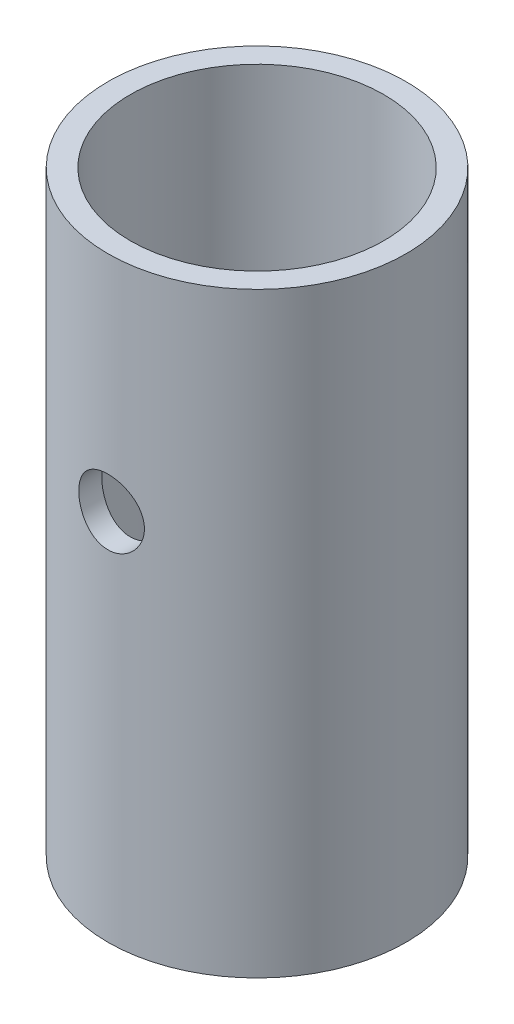
ISO-10303-21;
HEADER;
FILE_DESCRIPTION(('STEP AP214'),'2;1');
FILE_NAME('part.step','',(''),(''),'','','');
FILE_SCHEMA(('AUTOMOTIVE_DESIGN { 1 0 10303 214 1 1 1 1 }'));
ENDSEC;
DATA;
#1=APPLICATION_CONTEXT('core data for automotive mechanical design processes');
#2=APPLICATION_PROTOCOL_DEFINITION('international standard','automotive_design',2000,#1);
#3=PRODUCT_CONTEXT('',#1,'mechanical');
#4=PRODUCT('Part','Part','',(#3));
#5=PRODUCT_RELATED_PRODUCT_CATEGORY('part','',(#4));
#6=PRODUCT_DEFINITION_FORMATION('','',#4);
#7=PRODUCT_DEFINITION_CONTEXT('part definition',#1,'design');
#8=PRODUCT_DEFINITION('design','',#6,#7);
#9=PRODUCT_DEFINITION_SHAPE('','',#8);
#10=(LENGTH_UNIT() NAMED_UNIT(*) SI_UNIT(.MILLI.,.METRE.));
#11=(NAMED_UNIT(*) PLANE_ANGLE_UNIT() SI_UNIT($,.RADIAN.));
#12=(NAMED_UNIT(*) SI_UNIT($,.STERADIAN.) SOLID_ANGLE_UNIT());
#13=UNCERTAINTY_MEASURE_WITH_UNIT(LENGTH_MEASURE(1.E-05),#10,'distance_accuracy_value','');
#14=(GEOMETRIC_REPRESENTATION_CONTEXT(3) GLOBAL_UNCERTAINTY_ASSIGNED_CONTEXT((#13)) GLOBAL_UNIT_ASSIGNED_CONTEXT((#10,
#11,#12)) REPRESENTATION_CONTEXT('',''));
#15=CARTESIAN_POINT('',(0.,0.,0.));
#16=DIRECTION('',(0.,0.,1.));
#17=DIRECTION('',(1.,0.,0.));
#18=AXIS2_PLACEMENT_3D('',#15,#16,#17);
#19=CARTESIAN_POINT('',(0.,20.,0.));
#20=DIRECTION('',(0.,-1.,0.));
#21=DIRECTION('',(0.,0.,-1.));
#22=AXIS2_PLACEMENT_3D('',#19,#20,#21);
#23=CYLINDRICAL_SURFACE('',#22,5.);
#24=CARTESIAN_POINT('',(0.,20.,0.));
#25=DIRECTION('',(0.,1.,0.));
#26=DIRECTION('',(0.,0.,1.));
#27=AXIS2_PLACEMENT_3D('',#24,#25,#26);
#28=CIRCLE('',#27,5.);
#29=CARTESIAN_POINT('',(0.,20.,5.));
#30=VERTEX_POINT('',#29);
#31=EDGE_CURVE('E10',#30,#30,#28,.T.);
#32=ORIENTED_EDGE('',*,*,#31,.F.);
#33=EDGE_LOOP('',(#32));
#34=FACE_BOUND('',#33,.T.);
#35=CARTESIAN_POINT('',(0.,0.,0.));
#36=DIRECTION('',(0.,1.,0.));
#37=DIRECTION('',(0.,0.,1.));
#38=AXIS2_PLACEMENT_3D('',#35,#36,#37);
#39=CIRCLE('',#38,5.);
#40=CARTESIAN_POINT('',(0.,0.,5.));
#41=VERTEX_POINT('',#40);
#42=EDGE_CURVE('E44',#41,#41,#39,.T.);
#43=ORIENTED_EDGE('',*,*,#42,.T.);
#44=EDGE_LOOP('',(#43));
#45=FACE_BOUND('',#44,.T.);
#46=CARTESIAN_POINT('',(-1.1,12.5,4.87749935930288));
#47=CARTESIAN_POINT('',(-1.09999791492612,12.4390201794353,4.87750059192786));
#48=CARTESIAN_POINT('',(-1.09491201866376,12.3780153781133,4.87865539644142));
#49=CARTESIAN_POINT('',(-1.07472546298642,12.2577412903202,4.88314122250592));
#50=CARTESIAN_POINT('',(-1.05961761771207,12.1984732810123,4.88647380552498));
#51=CARTESIAN_POINT('',(-1.0198864288525,12.0834299805971,4.8949199053444));
#52=CARTESIAN_POINT('',(-0.995273595944624,12.0276509102885,4.90003145433793));
#53=CARTESIAN_POINT('',(-0.937261257278608,11.9210123020745,4.91145717082736));
#54=CARTESIAN_POINT('',(-0.903861910884835,11.870152674966,4.91777131651074));
#55=CARTESIAN_POINT('',(-0.828616225712396,11.7739268394913,4.93101133539934));
#56=CARTESIAN_POINT('',(-0.786648093254168,11.7286569406612,4.93794511097894));
#57=CARTESIAN_POINT('',(-0.695719054453303,11.6457392824436,4.95157396934833));
#58=CARTESIAN_POINT('',(-0.646757601115515,11.6080921198395,4.95826903341562));
#59=CARTESIAN_POINT('',(-0.542585501574226,11.5411071356613,4.97075222751559));
#60=CARTESIAN_POINT('',(-0.487313887417923,11.5118620215218,4.97652994590525));
#61=CARTESIAN_POINT('',(-0.372492215823986,11.4631111971503,4.98643815937044));
#62=CARTESIAN_POINT('',(-0.312942645065845,11.4436043810467,4.99056884147106));
#63=CARTESIAN_POINT('',(-0.19225695217033,11.4151870003743,4.99666172270461));
#64=CARTESIAN_POINT('',(-0.131160926699203,11.4061134155394,4.99865724849314));
#65=CARTESIAN_POINT('',(-0.00828344107533832,11.3983102891562,5.00037046767796));
#66=CARTESIAN_POINT('',(0.0534979389590021,11.3995795509866,5.0000884245789));
#67=CARTESIAN_POINT('',(0.174868311810049,11.4123048335302,4.99730372921666));
#68=CARTESIAN_POINT('',(0.234476737170561,11.4235851295636,4.99483938472223));
#69=CARTESIAN_POINT('',(0.350933235851258,11.4557321587748,4.98801066744812));
#70=CARTESIAN_POINT('',(0.40778118327906,11.4765993287116,4.98364620810345));
#71=CARTESIAN_POINT('',(0.517589876653114,11.5274826854318,4.9734461693194));
#72=CARTESIAN_POINT('',(0.570518802020045,11.5575653243528,4.96759995975693));
#73=CARTESIAN_POINT('',(0.670641236268086,11.625976099281,4.95507718712354));
#74=CARTESIAN_POINT('',(0.717833953910853,11.6643053707932,4.94840050975635));
#75=CARTESIAN_POINT('',(0.806189587464993,11.7490775203197,4.9347848703112));
#76=CARTESIAN_POINT('',(0.847204687115553,11.7956741878922,4.92784334554032));
#77=CARTESIAN_POINT('',(0.920866253616029,11.895156171251,4.91461189441242));
#78=CARTESIAN_POINT('',(0.953512488233042,11.9480416614901,4.9083219861404));
#79=CARTESIAN_POINT('',(1.00957639469399,12.05884098991,4.89709906904938));
#80=CARTESIAN_POINT('',(1.03296584029736,12.1167695604547,4.89217022405119));
#81=CARTESIAN_POINT('',(1.06963334728129,12.2358691363649,4.88428499577542));
#82=CARTESIAN_POINT('',(1.08291303337616,12.2970396190399,4.88132829556882));
#83=CARTESIAN_POINT('',(1.09875417213259,12.4195351781427,4.87778683874614));
#84=CARTESIAN_POINT('',(1.10153098432832,12.4808310591978,4.87715443070833));
#85=CARTESIAN_POINT('',(1.09687086480016,12.603009920137,4.87820457466623));
#86=CARTESIAN_POINT('',(1.08943464358614,12.6638929284482,4.87988696562384));
#87=CARTESIAN_POINT('',(1.0647464744292,12.7827660294168,4.88533212070861));
#88=CARTESIAN_POINT('',(1.04761340088456,12.8407820720377,4.8890696749398));
#89=CARTESIAN_POINT('',(1.00414670243287,12.9531199865384,4.89818124053484));
#90=CARTESIAN_POINT('',(0.977812188429666,13.0074415008253,4.90355541003142));
#91=CARTESIAN_POINT('',(0.916216590314429,13.1117795960781,4.91543919766926));
#92=CARTESIAN_POINT('',(0.880822990698791,13.1617160447288,4.92196518151733));
#93=CARTESIAN_POINT('',(0.802287084126657,13.2550198079413,4.9353742402688));
#94=CARTESIAN_POINT('',(0.759143803103171,13.2983862954519,4.94225735998361));
#95=CARTESIAN_POINT('',(0.665358139823839,13.3781564301322,4.9557623831032));
#96=CARTESIAN_POINT('',(0.614589557453772,13.4144131670077,4.96237690160789));
#97=CARTESIAN_POINT('',(0.507557357883074,13.4778834007809,4.97446295328536));
#98=CARTESIAN_POINT('',(0.451293999053489,13.505097322618,4.97993454016225));
#99=CARTESIAN_POINT('',(0.335221928140963,13.5495055262718,4.98908712095462));
#100=CARTESIAN_POINT('',(0.275438598062819,13.5667636957286,4.99277950649837));
#101=CARTESIAN_POINT('',(0.153730744771622,13.5909697622185,4.99800693284399));
#102=CARTESIAN_POINT('',(0.0918065380326908,13.5979191765264,4.99954229112211));
#103=CARTESIAN_POINT('',(-0.0310311984112514,13.601241579835,5.0002731072272));
#104=CARTESIAN_POINT('',(-0.0919386128262415,13.5978338089841,4.99951707009962));
#105=CARTESIAN_POINT('',(-0.212289959032806,13.5810294212509,4.99585410740956));
#106=CARTESIAN_POINT('',(-0.271733917710234,13.5676329880168,4.99294722139186));
#107=CARTESIAN_POINT('',(-0.387299068879443,13.5313371302719,4.9853129244489));
#108=CARTESIAN_POINT('',(-0.443430555354195,13.5084691336325,4.9805915379725));
#109=CARTESIAN_POINT('',(-0.551088880418724,13.4539098032859,4.96983212605049));
#110=CARTESIAN_POINT('',(-0.602615265777602,13.4222176023669,4.96379397121017));
#111=CARTESIAN_POINT('',(-0.70066904755235,13.3501963822896,4.95091484957698));
#112=CARTESIAN_POINT('',(-0.747081628642718,13.3097133893658,4.94406070779334));
#113=CARTESIAN_POINT('',(-0.832529567035145,13.2215698864255,4.93039261746621));
#114=CARTESIAN_POINT('',(-0.871563140639815,13.1739076459889,4.92357867902557));
#115=CARTESIAN_POINT('',(-0.94165547256129,13.0719811785591,4.91065939968106));
#116=CARTESIAN_POINT('',(-0.972598894559436,13.0176361803607,4.9045649222985));
#117=CARTESIAN_POINT('',(-1.02486431597407,12.9043945846594,4.89391152757272));
#118=CARTESIAN_POINT('',(-1.04619441572814,12.8455018683397,4.88935131825544));
#119=CARTESIAN_POINT('',(-1.07484341292603,12.7387957323776,4.88312099991116));
#120=CARTESIAN_POINT('',(-1.08425895070442,12.6915587964561,4.88102694527707));
#121=CARTESIAN_POINT('',(-1.0968379109729,12.5962197295076,4.87821567299023));
#122=CARTESIAN_POINT('',(-1.10000164527932,12.5481176417518,4.87749838666953));
#123=CARTESIAN_POINT('',(-1.1,12.5,4.87749935930288));
#124=B_SPLINE_CURVE_WITH_KNOTS('',3,(#46,#47,#48,#49,#50,#51,#52,#53,#54,#55,#56,#57,#58,#59,
#60,#61,#62,#63,#64,#65,#66,#67,#68,#69,#70,#71,#72,#73,#74,#75,#76,#77,#78,#79,#80,#81,#82,#83,
#84,#85,#86,#87,#88,#89,#90,#91,#92,#93,#94,#95,#96,#97,#98,#99,#100,#101,#102,#103,#104,#105,
#106,#107,#108,#109,#110,#111,#112,#113,#114,#115,#116,#117,#118,#119,#120,#121,#122,#123),
.UNSPECIFIED.,.T.,.F.,(4,2,2,2,2,2,2,2,2,2,2,2,2,2,2,2,2,2,2,2,2,2,2,2,2,2,2,2,2,2,2,2,2,2,2,2,
2,2,4),(0.,0.182763101090786,0.365657387395346,0.548350004463604,0.731039308194149,
0.91653294157345,1.10204109162356,1.28952374121687,1.47698509561857,1.66147574685417,
1.84594505364379,2.02723901933906,2.20854124524725,2.39118289476655,2.573849708903,
2.76036115186886,2.946877769898,3.13395882042845,3.32100979927812,3.50420386278735,
3.68738518232592,3.86836805363358,4.04936841738637,4.23318501321453,4.4170247293642,
4.60433520453909,4.79163687638516,4.97772283580126,5.16378140378501,5.34592912523116,
5.5280734978526,5.70961827316064,5.89118089635048,6.07622535920623,6.26131449506935,
6.44891386127562,6.6363548563871,6.78057581330699,6.92478957684879),.UNSPECIFIED.);
#125=CARTESIAN_POINT('',(-1.1,12.5,4.87749935930288));
#126=VERTEX_POINT('',#125);
#127=EDGE_CURVE('E75',#126,#126,#124,.T.);
#128=ORIENTED_EDGE('',*,*,#127,.F.);
#129=EDGE_LOOP('',(#128));
#130=FACE_BOUND('',#129,.T.);
#131=CARTESIAN_POINT('',(0.,13.6,-5.));
#132=CARTESIAN_POINT('',(0.0609999595605344,13.5999979292555,-4.99999887616071));
#133=CARTESIAN_POINT('',(0.122024864570489,13.5949087873791,-4.99887236640976));
#134=CARTESIAN_POINT('',(0.242340682213434,13.5747081729391,-4.99448731688895));
#135=CARTESIAN_POINT('',(0.301630334476692,13.559589595489,-4.99122726573313));
#136=CARTESIAN_POINT('',(0.416719495178803,13.5198270359795,-4.98293803882235));
#137=CARTESIAN_POINT('',(0.472522599225151,13.4951930618229,-4.97791072230238));
#138=CARTESIAN_POINT('',(0.579201800209655,13.4371308726108,-4.96662927649013));
#139=CARTESIAN_POINT('',(0.630078013068214,13.4037028645311,-4.96037517607224));
#140=CARTESIAN_POINT('',(0.726286472895077,13.3284276594594,-4.94721161217635));
#141=CARTESIAN_POINT('',(0.771527352939545,13.2864651125803,-4.94029394178491));
#142=CARTESIAN_POINT('',(0.854388619012942,13.1955596011917,-4.92664060013214));
#143=CARTESIAN_POINT('',(0.892008319235033,13.1466160091538,-4.91990494529706));
#144=CARTESIAN_POINT('',(0.958963471917813,13.0424608952865,-4.90729728442084));
#145=CARTESIAN_POINT('',(0.98820146858182,12.9871853386441,-4.90143579096535));
#146=CARTESIAN_POINT('',(1.03693806360126,12.8723551638834,-4.89135798202062));
#147=CARTESIAN_POINT('',(1.05643784110249,12.812801064829,-4.88714146736375));
#148=CARTESIAN_POINT('',(1.08484213840973,12.6920959729311,-4.88091463585406));
#149=CARTESIAN_POINT('',(1.09390852357102,12.6309848442018,-4.87887065323905));
#150=CARTESIAN_POINT('',(1.10169200911268,12.5080773761011,-4.87711921535007));
#151=CARTESIAN_POINT('',(1.10041039697521,12.4462811229272,-4.87741146940502));
#152=CARTESIAN_POINT('',(1.08766448534754,12.3249623211137,-4.88026901349543));
#153=CARTESIAN_POINT('',(1.07638840428801,12.2654188581724,-4.88279228627148));
#154=CARTESIAN_POINT('',(1.04427191511887,12.1490900575517,-4.88976110659631));
#155=CARTESIAN_POINT('',(1.02343096479544,12.0923048764359,-4.89420676312044));
#156=CARTESIAN_POINT('',(0.972603991259565,11.9825763765649,-4.90456073289074));
#157=CARTESIAN_POINT('',(0.942545752161987,11.9296676368727,-4.9104805243165));
#158=CARTESIAN_POINT('',(0.874188211307937,11.829575454516,-4.92310873427439));
#159=CARTESIAN_POINT('',(0.83588777377836,11.7823928023078,-4.92981726143628));
#160=CARTESIAN_POINT('',(0.751137532534995,11.6940086914044,-4.94344721177287));
#161=CARTESIAN_POINT('',(0.704527725553291,11.6529607275567,-4.95037008112471));
#162=CARTESIAN_POINT('',(0.605007270039307,11.579238917392,-4.96351503501933));
#163=CARTESIAN_POINT('',(0.552096504798697,11.5465652262212,-4.96973710657755));
#164=CARTESIAN_POINT('',(0.441287511930196,11.4904808236904,-4.98079997404393));
#165=CARTESIAN_POINT('',(0.383378689102393,11.4670904094703,-4.98563773690335));
#166=CARTESIAN_POINT('',(0.264322427239234,11.4304150568188,-4.99336438083545));
#167=CARTESIAN_POINT('',(0.203175466193224,11.4171286313362,-4.99625354868486));
#168=CARTESIAN_POINT('',(0.0806951337888316,11.4012620918311,-4.99971659049809));
#169=CARTESIAN_POINT('',(0.0193901667559814,11.3984723277583,-5.00033579592629));
#170=CARTESIAN_POINT('',(-0.102809855689252,11.4031097966858,-4.99931625579903));
#171=CARTESIAN_POINT('',(-0.163704938957582,11.4105363281897,-4.99767766527392));
#172=CARTESIAN_POINT('',(-0.282660671832621,11.4352217675481,-4.99235527341082));
#173=CARTESIAN_POINT('',(-0.340745292202284,11.4523705438853,-4.98869439186058));
#174=CARTESIAN_POINT('',(-0.45321349739709,11.4958913050423,-4.97973725216115));
#175=CARTESIAN_POINT('',(-0.507596763912362,11.5222640819155,-4.97444085357672));
#176=CARTESIAN_POINT('',(-0.611984174520969,11.583919855479,-4.96268846914328));
#177=CARTESIAN_POINT('',(-0.661913906336768,11.6193257948506,-4.95621687062795));
#178=CARTESIAN_POINT('',(-0.755198474721215,11.6978811401243,-4.94286351602272));
#179=CARTESIAN_POINT('',(-0.798552445319055,11.7410315642773,-4.93598170607748));
#180=CARTESIAN_POINT('',(-0.878285066590871,11.8348135190665,-4.9224267180889));
#181=CARTESIAN_POINT('',(-0.914518464326388,11.8855696208637,-4.915759829214));
#182=CARTESIAN_POINT('',(-0.977947765230261,11.9925696168121,-4.90353605046082));
#183=CARTESIAN_POINT('',(-1.00514406089901,12.0488132724901,-4.89797911237922));
#184=CARTESIAN_POINT('',(-1.04954246502565,12.1648894462019,-4.88865786141391));
#185=CARTESIAN_POINT('',(-1.06680099884061,12.2246995308506,-4.88488345002477));
#186=CARTESIAN_POINT('',(-1.09099877035094,12.3464646538046,-4.87953666429121));
#187=CARTESIAN_POINT('',(-1.09793968040359,12.4084193428303,-4.87796393308446));
#188=CARTESIAN_POINT('',(-1.1012333592344,12.5312499795235,-4.87722125104816));
#189=CARTESIAN_POINT('',(-1.09781649694484,12.5921195466282,-4.8779990211444));
#190=CARTESIAN_POINT('',(-1.08100709980941,12.7123927425033,-4.88175137242458));
#191=CARTESIAN_POINT('',(-1.06761468536975,12.7717963889584,-4.88472592709306));
#192=CARTESIAN_POINT('',(-1.03134622878671,12.887265915763,-4.89251106034219));
#193=CARTESIAN_POINT('',(-1.00850408563873,12.9433429158269,-4.89731507127078));
#194=CARTESIAN_POINT('',(-0.9540135593264,13.0509027748405,-4.90822032953724));
#195=CARTESIAN_POINT('',(-0.92236424638541,13.1023851479753,-4.91432171382331));
#196=CARTESIAN_POINT('',(-0.850395309737888,13.2004291392396,-4.92729014360946));
#197=CARTESIAN_POINT('',(-0.809911671979782,13.2468686531017,-4.93417029120977));
#198=CARTESIAN_POINT('',(-0.72175516807186,13.3323706230285,-4.94783338665195));
#199=CARTESIAN_POINT('',(-0.674080641100261,13.3714313701725,-4.95461631164175));
#200=CARTESIAN_POINT('',(-0.572139645762662,13.4415594344417,-4.96742659150803));
#201=CARTESIAN_POINT('',(-0.517794695314206,13.472514812411,-4.97344283035883));
#202=CARTESIAN_POINT('',(-0.404551859645521,13.5248025988809,-4.98393015925119));
#203=CARTESIAN_POINT('',(-0.345657820131688,13.5461430335822,-4.98840253731883));
#204=CARTESIAN_POINT('',(-0.23892563773577,13.5748158459406,-4.99450541009833));
#205=CARTESIAN_POINT('',(-0.191662539589552,13.5842417958672,-4.99655306675253));
#206=CARTESIAN_POINT('',(-0.0962714475911047,13.5968345482913,-4.99930077467043));
#207=CARTESIAN_POINT('',(-0.0481434930158618,13.6000016343105,-5.0000008869768));
#208=CARTESIAN_POINT('',(0.,13.6,-5.));
#209=B_SPLINE_CURVE_WITH_KNOTS('',3,(#131,#132,#133,#134,#135,#136,#137,#138,#139,#140,#141,
#142,#143,#144,#145,#146,#147,#148,#149,#150,#151,#152,#153,#154,#155,#156,#157,#158,#159,#160,
#161,#162,#163,#164,#165,#166,#167,#168,#169,#170,#171,#172,#173,#174,#175,#176,#177,#178,#179,
#180,#181,#182,#183,#184,#185,#186,#187,#188,#189,#190,#191,#192,#193,#194,#195,#196,#197,#198,
#199,#200,#201,#202,#203,#204,#205,#206,#207,#208),.UNSPECIFIED.,.T.,.F.,(4,2,2,2,2,2,2,2,2,2,2,
2,2,2,2,2,2,2,2,2,2,2,2,2,2,2,2,2,2,2,2,2,2,2,2,2,2,2,4),(0.,0.182823646499007,
0.365776944395016,0.548538341185737,0.731295436902253,0.916709868622984,1.10214097782156,
1.28964796472437,1.47713224196011,1.66166688741998,1.84617857371231,2.02728761407922,
2.20840692243349,2.39098318435594,2.57358462137524,2.76018224872779,2.94678333283802,
3.13379018684497,3.32076951285242,3.50399384389164,3.68720559455758,3.86838228153855,
4.04957452975743,4.23337826229003,4.41720617920563,4.6044642781354,4.79171424298788,
4.977890267682,5.1640361122882,5.346072460439,5.52810661142294,5.7094933374829,5.89089921988555,
6.07601342659492,6.26117045329545,6.44876375359555,6.63620016645499,6.78049809308024,
6.92478948297247),.UNSPECIFIED.);
#210=CARTESIAN_POINT('',(0.,13.6,-5.));
#211=VERTEX_POINT('',#210);
#212=EDGE_CURVE('E80',#211,#211,#209,.T.);
#213=ORIENTED_EDGE('',*,*,#212,.F.);
#214=EDGE_LOOP('',(#213));
#215=FACE_BOUND('',#214,.T.);
#216=ADVANCED_FACE('F31',(#34,#45,#130,#215),#23,.T.);
#217=CARTESIAN_POINT('',(0.,2.5,0.));
#218=DIRECTION('',(0.,1.,0.));
#219=DIRECTION('',(0.,0.,1.));
#220=AXIS2_PLACEMENT_3D('',#217,#218,#219);
#221=CYLINDRICAL_SURFACE('',#220,4.25);
#222=CARTESIAN_POINT('',(0.,2.5,0.));
#223=DIRECTION('',(0.,1.,0.));
#224=DIRECTION('',(0.,0.,1.));
#225=AXIS2_PLACEMENT_3D('',#222,#223,#224);
#226=CIRCLE('',#225,4.25);
#227=CARTESIAN_POINT('',(0.,2.5,4.25));
#228=VERTEX_POINT('',#227);
#229=EDGE_CURVE('E49',#228,#228,#226,.T.);
#230=ORIENTED_EDGE('',*,*,#229,.F.);
#231=EDGE_LOOP('',(#230));
#232=FACE_BOUND('',#231,.T.);
#233=CARTESIAN_POINT('',(0.,20.,0.));
#234=DIRECTION('',(0.,1.,0.));
#235=DIRECTION('',(0.,0.,1.));
#236=AXIS2_PLACEMENT_3D('',#233,#234,#235);
#237=CIRCLE('',#236,4.25);
#238=CARTESIAN_POINT('',(0.,20.,4.25));
#239=VERTEX_POINT('',#238);
#240=EDGE_CURVE('E52',#239,#239,#237,.T.);
#241=ORIENTED_EDGE('',*,*,#240,.T.);
#242=EDGE_LOOP('',(#241));
#243=FACE_BOUND('',#242,.T.);
#244=CARTESIAN_POINT('',(-1.1,12.5,-4.1051796550212));
#245=CARTESIAN_POINT('',(-1.09999840789613,12.4393335126673,-4.10518076391033));
#246=CARTESIAN_POINT('',(-1.09496414449979,12.3786498181143,-4.10653914602961));
#247=CARTESIAN_POINT('',(-1.07499536272558,12.2590302392254,-4.1118107937748));
#248=CARTESIAN_POINT('',(-1.06005549954401,12.2000953164271,-4.11572543867628));
#249=CARTESIAN_POINT('',(-1.02079565634799,12.0857209024368,-4.12563722026117));
#250=CARTESIAN_POINT('',(-0.996488347337856,12.0302768066853,-4.13163154275243));
#251=CARTESIAN_POINT('',(-0.939222789109454,11.9242460790671,-4.14502372349914));
#252=CARTESIAN_POINT('',(-0.906264012198569,11.8736597437547,-4.15242166736026));
#253=CARTESIAN_POINT('',(-0.831800732899313,11.7775880304451,-4.16798285552306));
#254=CARTESIAN_POINT('',(-0.790129321830821,11.7322340885967,-4.17615903412427));
#255=CARTESIAN_POINT('',(-0.699782899200872,11.6490745962622,-4.19224353588109));
#256=CARTESIAN_POINT('',(-0.651107197097436,11.6112697909121,-4.20015183253156));
#257=CARTESIAN_POINT('',(-0.547227756075999,11.5437385669958,-4.21495326605561));
#258=CARTESIAN_POINT('',(-0.491936912602005,11.5141420777006,-4.22182936253235));
#259=CARTESIAN_POINT('',(-0.376956783910095,11.4647137550792,-4.23364364296346));
#260=CARTESIAN_POINT('',(-0.317268197587542,11.4448803740181,-4.23858213405909));
#261=CARTESIAN_POINT('',(-0.196558052734741,11.4159645521774,-4.24587332194703));
#262=CARTESIAN_POINT('',(-0.135593306753533,11.4066587097006,-4.24827967206326));
#263=CARTESIAN_POINT('',(-0.0129236529245644,11.3983600345516,-4.25042274145133));
#264=CARTESIAN_POINT('',(0.0487811364118394,11.3993655720607,-4.2501598826189));
#265=CARTESIAN_POINT('',(0.169626994444423,11.4115021882932,-4.24703376306772));
#266=CARTESIAN_POINT('',(0.228794138602177,11.4223920099158,-4.24423246366471));
#267=CARTESIAN_POINT('',(0.344430852226463,11.4535992542332,-4.23641686940759));
#268=CARTESIAN_POINT('',(0.400900272363488,11.4739171981459,-4.23140245220576));
#269=CARTESIAN_POINT('',(0.510163877846315,11.5235937385468,-4.21963076523455));
#270=CARTESIAN_POINT('',(0.562917979729678,11.5530365194166,-4.21285736581185));
#271=CARTESIAN_POINT('',(0.66281999828212,11.620062714315,-4.19829989173951));
#272=CARTESIAN_POINT('',(0.709966875211983,11.657647634494,-4.19051563020529));
#273=CARTESIAN_POINT('',(0.798755635109295,11.7411779899902,-4.17451624165305));
#274=CARTESIAN_POINT('',(0.840198518480594,11.787334049386,-4.16629516536962));
#275=CARTESIAN_POINT('',(0.914802322233676,11.8860265689051,-4.15055351970859));
#276=CARTESIAN_POINT('',(0.947962796159858,11.9385633727498,-4.14303298810689));
#277=CARTESIAN_POINT('',(1.00520034751384,12.0489378179507,-4.12952126108639));
#278=CARTESIAN_POINT('',(1.02922630581518,12.1068031033073,-4.12353873135906));
#279=CARTESIAN_POINT('',(1.06714537672788,12.2259444934767,-4.11388961604198));
#280=CARTESIAN_POINT('',(1.08104083594467,12.287219804857,-4.11022249414289));
#281=CARTESIAN_POINT('',(1.0979675908435,12.409588212923,-4.10573285522402));
#282=CARTESIAN_POINT('',(1.10129448518017,12.4706376286745,-4.10483296345961));
#283=CARTESIAN_POINT('',(1.09780163464738,12.5924199315725,-4.10576849285754));
#284=CARTESIAN_POINT('',(1.09098289917398,12.6531528496044,-4.10760364190872));
#285=CARTESIAN_POINT('',(1.06765228026653,12.7714590783592,-4.11372802188775));
#286=CARTESIAN_POINT('',(1.05131540620921,12.8290694186266,-4.11797290987683));
#287=CARTESIAN_POINT('',(1.00960771837504,12.9407330721747,-4.12839573810022));
#288=CARTESIAN_POINT('',(0.984235776345391,12.9947859402173,-4.13457391974258));
#289=CARTESIAN_POINT('',(0.924569195117598,13.0990445435072,-4.14832797721752));
#290=CARTESIAN_POINT('',(0.890099467187115,13.1491465057747,-4.15593032081221));
#291=CARTESIAN_POINT('',(0.813434888928481,13.242963654364,-4.17161257593214));
#292=CARTESIAN_POINT('',(0.771238673802814,13.2866777098767,-4.17969257165825));
#293=CARTESIAN_POINT('',(0.67895672124908,13.3676910348198,-4.19568411513739));
#294=CARTESIAN_POINT('',(0.628688544608278,13.4047849509184,-4.20358520472401));
#295=CARTESIAN_POINT('',(0.522466234720425,13.4700064172403,-4.21810362087798));
#296=CARTESIAN_POINT('',(0.466512402583268,13.4981344419673,-4.22472101537533));
#297=CARTESIAN_POINT('',(0.350898903828185,13.5443735722375,-4.23588410461412));
#298=CARTESIAN_POINT('',(0.291270241199569,13.5625583550773,-4.24044499213448));
#299=CARTESIAN_POINT('',(0.169668648469188,13.588612335674,-4.24704788516586));
#300=CARTESIAN_POINT('',(0.107696208379324,13.5964836775223,-4.24909041422055));
#301=CARTESIAN_POINT('',(-0.0149102354822938,13.6015595327331,-4.25040332927876));
#302=CARTESIAN_POINT('',(-0.0755310751389491,13.5990661293375,-4.24975222462969));
#303=CARTESIAN_POINT('',(-0.195459189505362,13.584180140895,-4.24592692871477));
#304=CARTESIAN_POINT('',(-0.254766508456513,13.5717878897792,-4.24275282256072));
#305=CARTESIAN_POINT('',(-0.370043174282501,13.5376226877929,-4.23425212882175));
#306=CARTESIAN_POINT('',(-0.426030795576919,13.5159078568896,-4.22893888984516));
#307=CARTESIAN_POINT('',(-0.533599855818371,13.4637661095105,-4.21671733182277));
#308=CARTESIAN_POINT('',(-0.585180704403626,13.4333380281161,-4.20980879951804));
#309=CARTESIAN_POINT('',(-0.683890956464065,13.3637316454665,-4.19491956149664));
#310=CARTESIAN_POINT('',(-0.730874098246433,13.3243508040887,-4.18691608814168));
#311=CARTESIAN_POINT('',(-0.817667476733351,13.2383452607287,-4.17083594173034));
#312=CARTESIAN_POINT('',(-0.857475857178064,13.1917186899197,-4.16275925029698));
#313=CARTESIAN_POINT('',(-0.929589633626375,13.0914019106216,-4.14725865735276));
#314=CARTESIAN_POINT('',(-0.961725626967664,13.0375871352435,-4.13985140975207));
#315=CARTESIAN_POINT('',(-1.01644730067242,12.9251339432282,-4.12675804515801));
#316=CARTESIAN_POINT('',(-1.03903956711113,12.8664988865322,-4.12107074201266));
#317=CARTESIAN_POINT('',(-1.07087972225876,12.7566870388975,-4.11289862447253));
#318=CARTESIAN_POINT('',(-1.08177507842024,12.7060106404529,-4.11002663701953));
#319=CARTESIAN_POINT('',(-1.0963355369905,12.6035602676517,-4.10616677277321));
#320=CARTESIAN_POINT('',(-1.10000135905896,12.5517864030605,-4.10517870844622));
#321=CARTESIAN_POINT('',(-1.1,12.5,-4.1051796550212));
#322=B_SPLINE_CURVE_WITH_KNOTS('',3,(#244,#245,#246,#247,#248,#249,#250,#251,#252,#253,#254,
#255,#256,#257,#258,#259,#260,#261,#262,#263,#264,#265,#266,#267,#268,#269,#270,#271,#272,#273,
#274,#275,#276,#277,#278,#279,#280,#281,#282,#283,#284,#285,#286,#287,#288,#289,#290,#291,#292,
#293,#294,#295,#296,#297,#298,#299,#300,#301,#302,#303,#304,#305,#306,#307,#308,#309,#310,#311,
#312,#313,#314,#315,#316,#317,#318,#319,#320,#321),.UNSPECIFIED.,.T.,.F.,(4,2,2,2,2,2,2,2,2,2,2,
2,2,2,2,2,2,2,2,2,2,2,2,2,2,2,2,2,2,2,2,2,2,2,2,2,2,2,4),(0.,0.181809157173973,
0.363716493754889,0.545378629682173,0.727051848590119,0.912590581250138,1.09814761842885,
1.28649299345696,1.47480850067385,1.6590481157011,1.84325861022937,2.02309033358188,
2.20293199981233,2.38448490234754,2.56607141764658,2.75291742261345,2.93977349716837,
3.12766039168834,3.31550375068161,3.49804471903363,3.68056752746675,3.85983571888052,
4.03912630423799,4.22215692782264,4.40521991296191,4.59323157569407,4.78123328659295,
4.9678223863483,5.154372689394,5.3355246347999,5.51667046942277,5.69670301803797,
5.87675964736351,6.06138760380679,6.24606325898351,6.43450174698238,6.62280998130039,
6.77802219289907,6.9332189532104),.UNSPECIFIED.);
#323=CARTESIAN_POINT('',(-1.1,12.5,-4.1051796550212));
#324=VERTEX_POINT('',#323);
#325=EDGE_CURVE('E54',#324,#324,#322,.T.);
#326=ORIENTED_EDGE('',*,*,#325,.F.);
#327=EDGE_LOOP('',(#326));
#328=FACE_BOUND('',#327,.T.);
#329=CARTESIAN_POINT('',(0.,11.4,4.25));
#330=CARTESIAN_POINT('',(-0.0607048962607819,11.4000015709662,4.2499990264258));
#331=CARTESIAN_POINT('',(-0.121426957111307,11.4050419910275,4.2486865063183));
#332=CARTESIAN_POINT('',(-0.241126111457467,11.4250374399053,4.24357793136069));
#333=CARTESIAN_POINT('',(-0.300102277214647,11.439997644526,4.23978058002427));
#334=CARTESIAN_POINT('',(-0.414564183739061,11.4793169263231,4.23012212600207));
#335=CARTESIAN_POINT('',(-0.470054178000904,11.5036642806051,4.22426359815729));
#336=CARTESIAN_POINT('',(-0.576162721559002,11.5610243234618,4.21110421834428));
#337=CARTESIAN_POINT('',(-0.626781021796982,11.5940374547405,4.20380329269375));
#338=CARTESIAN_POINT('',(-0.722820498165259,11.6685572559975,4.18837024899101));
#339=CARTESIAN_POINT('',(-0.768119490106769,11.7102185929993,4.18022457805011));
#340=CARTESIAN_POINT('',(-0.85117183452962,11.8005213202099,4.16410856533065));
#341=CARTESIAN_POINT('',(-0.888924274052399,11.8491635537246,4.15613824486911));
#342=CARTESIAN_POINT('',(-0.956397494879625,11.9530098701209,4.1411376936681));
#343=CARTESIAN_POINT('',(-0.985979571569174,12.0083067789327,4.13412461377826));
#344=CARTESIAN_POINT('',(-1.0353796196786,12.123299865174,4.12203109119439));
#345=CARTESIAN_POINT('',(-1.05519927620802,12.1829952813226,4.11695031499633));
#346=CARTESIAN_POINT('',(-1.08409112393986,12.3037422231794,4.10943629107034));
#347=CARTESIAN_POINT('',(-1.09338397207461,12.364737493582,4.10694877739481));
#348=CARTESIAN_POINT('',(-1.10164605330124,12.4874680945526,4.10474064733562));
#349=CARTESIAN_POINT('',(-1.10061709516563,12.5492032935633,4.10501954617132));
#350=CARTESIAN_POINT('',(-1.08844036809445,12.6699540214986,4.10826405978019));
#351=CARTESIAN_POINT('',(-1.07755764344,12.7289984671596,4.11115929691492));
#352=CARTESIAN_POINT('',(-1.04640599391119,12.8443936040589,4.11919783230054));
#353=CARTESIAN_POINT('',(-1.02613635772945,12.9007440908013,4.1243413009129));
#354=CARTESIAN_POINT('',(-0.976565584580729,13.0098520610492,4.13635993624612));
#355=CARTESIAN_POINT('',(-0.947169969909126,13.0625645577886,4.14325307368672));
#356=CARTESIAN_POINT('',(-0.880247660386041,13.1624027091252,4.15798447287412));
#357=CARTESIAN_POINT('',(-0.842719449356824,13.2095273194225,4.16582291073433));
#358=CARTESIAN_POINT('',(-0.759233573027629,13.2983685173122,4.18185628269265));
#359=CARTESIAN_POINT('',(-0.713052808397007,13.3398750907268,4.19005477996947));
#360=CARTESIAN_POINT('',(-0.614286849152374,13.4145961782027,4.20566850238286));
#361=CARTESIAN_POINT('',(-0.561701430333718,13.4478104018534,4.21308370008186));
#362=CARTESIAN_POINT('',(-0.451305886452562,13.5050890390434,4.22633667048985));
#363=CARTESIAN_POINT('',(-0.393476209295571,13.5291173108852,4.23216818675516));
#364=CARTESIAN_POINT('',(-0.274413263815521,13.567051492548,4.241551401155));
#365=CARTESIAN_POINT('',(-0.213180697572157,13.5809594820885,4.2451035676785));
#366=CARTESIAN_POINT('',(-0.0908440066483363,13.5979328685087,4.24945774101222));
#367=CARTESIAN_POINT('',(-0.0297820476907902,13.6012840160649,4.25033220853217));
#368=CARTESIAN_POINT('',(0.0920307975202352,13.5978351469825,4.24943985272484));
#369=CARTESIAN_POINT('',(0.152781713357463,13.5910361144404,4.24767328545534));
#370=CARTESIAN_POINT('',(0.27124095725294,13.5677148411499,4.24174398452779));
#371=CARTESIAN_POINT('',(0.328982458752076,13.5513503137972,4.23762014083869));
#372=CARTESIAN_POINT('',(0.440896387865245,13.509544288495,4.22744256198165));
#373=CARTESIAN_POINT('',(0.495068440013864,13.4841018374512,4.22138862417961));
#374=CARTESIAN_POINT('',(0.599428780646017,13.4243208326871,4.20785077752365));
#375=CARTESIAN_POINT('',(0.649523485353886,13.389824628554,4.20034221639004));
#376=CARTESIAN_POINT('',(0.743314006598134,13.3131151007071,4.1847638487124));
#377=CARTESIAN_POINT('',(0.787008632662346,13.2709003445481,4.17669393816303));
#378=CARTESIAN_POINT('',(0.86795018723449,13.1786215849865,4.16063852738442));
#379=CARTESIAN_POINT('',(0.904996035136212,13.1283795216918,4.15266090379453));
#380=CARTESIAN_POINT('',(0.970132980606654,13.022225177753,4.13792961654545));
#381=CARTESIAN_POINT('',(0.99822446610615,12.966313142888,4.13117589986828));
#382=CARTESIAN_POINT('',(1.04444412789632,12.8506967501108,4.11973344334853));
#383=CARTESIAN_POINT('',(1.06263091010975,12.7910170835808,4.11503259029842));
#384=CARTESIAN_POINT('',(1.08867173862583,12.6693055364506,4.10822083699823));
#385=CARTESIAN_POINT('',(1.09652824093857,12.6072742185617,4.10610932114477));
#386=CARTESIAN_POINT('',(1.10155032410965,12.4846728059176,4.10476460848824));
#387=CARTESIAN_POINT('',(1.09903821017487,12.4241166614934,4.10544463387302));
#388=CARTESIAN_POINT('',(1.0841372325577,12.3043230574226,4.10940442134593));
#389=CARTESIAN_POINT('',(1.07174859571245,12.2450855675222,4.11268412372649));
#390=CARTESIAN_POINT('',(1.03762801076138,12.1299900482052,4.12142362357868));
#391=CARTESIAN_POINT('',(1.01596061196626,12.0741116581468,4.12686834138395));
#392=CARTESIAN_POINT('',(0.963948055000066,11.9667420178428,4.1393255634839));
#393=CARTESIAN_POINT('',(0.933601609390047,11.9152514199486,4.14633830034287));
#394=CARTESIAN_POINT('',(0.864099530422613,11.816571403345,4.16138529701044));
#395=CARTESIAN_POINT('',(0.82472217805997,11.7695416297031,4.16944255995157));
#396=CARTESIAN_POINT('',(0.738702715440553,11.6826526322519,4.18553814623184));
#397=CARTESIAN_POINT('',(0.692058862197446,11.6427951337837,4.19357646455599));
#398=CARTESIAN_POINT('',(0.591715973091001,11.5706093248195,4.20891858352018));
#399=CARTESIAN_POINT('',(0.537895542342168,11.5384456979146,4.21620469168722));
#400=CARTESIAN_POINT('',(0.425426152792787,11.483673790517,4.22903132206126));
#401=CARTESIAN_POINT('',(0.366780499049003,11.4610590335268,4.23457302675426));
#402=CARTESIAN_POINT('',(0.256914253830754,11.4291722361625,4.24252047112755));
#403=CARTESIAN_POINT('',(0.206191737506106,11.4182572021728,4.24530542115602));
#404=CARTESIAN_POINT('',(0.103650254733046,11.4036707283274,4.24904552167655));
#405=CARTESIAN_POINT('',(0.0518313840127724,11.3999986586691,4.25000083126241));
#406=CARTESIAN_POINT('',(0.,11.4,4.25));
#407=B_SPLINE_CURVE_WITH_KNOTS('',3,(#329,#330,#331,#332,#333,#334,#335,#336,#337,#338,#339,
#340,#341,#342,#343,#344,#345,#346,#347,#348,#349,#350,#351,#352,#353,#354,#355,#356,#357,#358,
#359,#360,#361,#362,#363,#364,#365,#366,#367,#368,#369,#370,#371,#372,#373,#374,#375,#376,#377,
#378,#379,#380,#381,#382,#383,#384,#385,#386,#387,#388,#389,#390,#391,#392,#393,#394,#395,#396,
#397,#398,#399,#400,#401,#402,#403,#404,#405,#406),.UNSPECIFIED.,.T.,.F.,(4,2,2,2,2,2,2,2,2,2,2,
2,2,2,2,2,2,2,2,2,2,2,2,2,2,2,2,2,2,2,2,2,2,2,2,2,2,2,4),(0.,0.181924675254523,
0.363944347352315,0.545737441430482,0.727539824484926,0.912927667397934,1.09833792440338,
1.28672544771248,1.47508044169456,1.65940962780579,1.84370651300677,2.02318885823684,
2.2026848062385,2.38410472886633,2.56555850314956,2.75257358109702,2.93959520767398,
3.12734526944068,3.31505673763847,3.49764157196949,3.68020870519522,3.85984739053511,
4.039504941752,4.22252639210845,4.40558184298483,4.59347848640944,4.78136698846144,
4.96813133380264,5.1548512681396,5.33581148726387,5.51676755033889,5.6964847049903,
5.87622853249904,6.06097621873052,6.24576828807224,6.43421883327157,6.62254135623781,
6.77788677834871,6.93321869200536),.UNSPECIFIED.);
#408=CARTESIAN_POINT('',(0.,11.4,4.25));
#409=VERTEX_POINT('',#408);
#410=EDGE_CURVE('E35',#409,#409,#407,.T.);
#411=ORIENTED_EDGE('',*,*,#410,.F.);
#412=EDGE_LOOP('',(#411));
#413=FACE_BOUND('',#412,.T.);
#414=ADVANCED_FACE('F59',(#232,#243,#328,#413),#221,.F.);
#415=CARTESIAN_POINT('',(0.,20.,0.));
#416=DIRECTION('',(0.,1.,0.));
#417=DIRECTION('',(0.,0.,1.));
#418=AXIS2_PLACEMENT_3D('',#415,#416,#417);
#419=PLANE('',#418);
#420=ORIENTED_EDGE('',*,*,#240,.F.);
#421=EDGE_LOOP('',(#420));
#422=FACE_BOUND('',#421,.T.);
#423=ORIENTED_EDGE('',*,*,#31,.T.);
#424=EDGE_LOOP('',(#423));
#425=FACE_BOUND('',#424,.T.);
#426=ADVANCED_FACE('F99',(#422,#425),#419,.T.);
#427=CARTESIAN_POINT('',(0.,0.,0.));
#428=DIRECTION('',(0.,1.,0.));
#429=DIRECTION('',(0.,0.,1.));
#430=AXIS2_PLACEMENT_3D('',#427,#428,#429);
#431=PLANE('',#430);
#432=CARTESIAN_POINT('',(0.,0.,0.));
#433=DIRECTION('',(0.,-1.,0.));
#434=DIRECTION('',(0.,0.,-1.));
#435=AXIS2_PLACEMENT_3D('',#432,#433,#434);
#436=CIRCLE('',#435,1.25);
#437=CARTESIAN_POINT('',(0.,0.,-1.25));
#438=VERTEX_POINT('',#437);
#439=EDGE_CURVE('E86',#438,#438,#436,.T.);
#440=ORIENTED_EDGE('',*,*,#439,.F.);
#441=EDGE_LOOP('',(#440));
#442=FACE_BOUND('',#441,.T.);
#443=ORIENTED_EDGE('',*,*,#42,.F.);
#444=EDGE_LOOP('',(#443));
#445=FACE_BOUND('',#444,.T.);
#446=ADVANCED_FACE('F101',(#442,#445),#431,.F.);
#447=CARTESIAN_POINT('',(0.,2.5,0.));
#448=DIRECTION('',(0.,1.,0.));
#449=DIRECTION('',(0.,0.,1.));
#450=AXIS2_PLACEMENT_3D('',#447,#448,#449);
#451=PLANE('',#450);
#452=CARTESIAN_POINT('',(0.,2.5,0.));
#453=DIRECTION('',(0.,-1.,0.));
#454=DIRECTION('',(0.,0.,-1.));
#455=AXIS2_PLACEMENT_3D('',#452,#453,#454);
#456=CIRCLE('',#455,1.25);
#457=CARTESIAN_POINT('',(0.,2.5,-1.25));
#458=VERTEX_POINT('',#457);
#459=EDGE_CURVE('E87',#458,#458,#456,.T.);
#460=ORIENTED_EDGE('',*,*,#459,.T.);
#461=EDGE_LOOP('',(#460));
#462=FACE_BOUND('',#461,.T.);
#463=ORIENTED_EDGE('',*,*,#229,.T.);
#464=EDGE_LOOP('',(#463));
#465=FACE_BOUND('',#464,.T.);
#466=ADVANCED_FACE('F106',(#462,#465),#451,.T.);
#467=CARTESIAN_POINT('',(0.,2.5,0.));
#468=DIRECTION('',(0.,-1.,0.));
#469=DIRECTION('',(0.,0.,-1.));
#470=AXIS2_PLACEMENT_3D('',#467,#468,#469);
#471=CYLINDRICAL_SURFACE('',#470,1.25);
#472=ORIENTED_EDGE('',*,*,#459,.F.);
#473=EDGE_LOOP('',(#472));
#474=FACE_BOUND('',#473,.T.);
#475=ORIENTED_EDGE('',*,*,#439,.T.);
#476=EDGE_LOOP('',(#475));
#477=FACE_BOUND('',#476,.T.);
#478=ADVANCED_FACE('F68',(#474,#477),#471,.F.);
#479=CARTESIAN_POINT('',(0.,12.5,10.));
#480=DIRECTION('',(0.,0.,-1.));
#481=DIRECTION('',(-1.,0.,0.));
#482=AXIS2_PLACEMENT_3D('',#479,#480,#481);
#483=CYLINDRICAL_SURFACE('',#482,1.1);
#484=ORIENTED_EDGE('',*,*,#325,.T.);
#485=EDGE_LOOP('',(#484));
#486=FACE_BOUND('',#485,.T.);
#487=ORIENTED_EDGE('',*,*,#212,.T.);
#488=EDGE_LOOP('',(#487));
#489=FACE_BOUND('',#488,.T.);
#490=ADVANCED_FACE('F63',(#486,#489),#483,.F.);
#491=ORIENTED_EDGE('',*,*,#410,.T.);
#492=EDGE_LOOP('',(#491));
#493=FACE_BOUND('',#492,.T.);
#494=ORIENTED_EDGE('',*,*,#127,.T.);
#495=EDGE_LOOP('',(#494));
#496=FACE_BOUND('',#495,.T.);
#497=ADVANCED_FACE('F67',(#493,#496),#483,.F.);
#498=CLOSED_SHELL('',(#216,#414,#426,#446,#466,#478,#490,#497));
#499=MANIFOLD_SOLID_BREP('B2',#498);
#500=ADVANCED_BREP_SHAPE_REPRESENTATION('',(#18,#499),#14);
#501=SHAPE_DEFINITION_REPRESENTATION(#9,#500);
ENDSEC;
END-ISO-10303-21;
